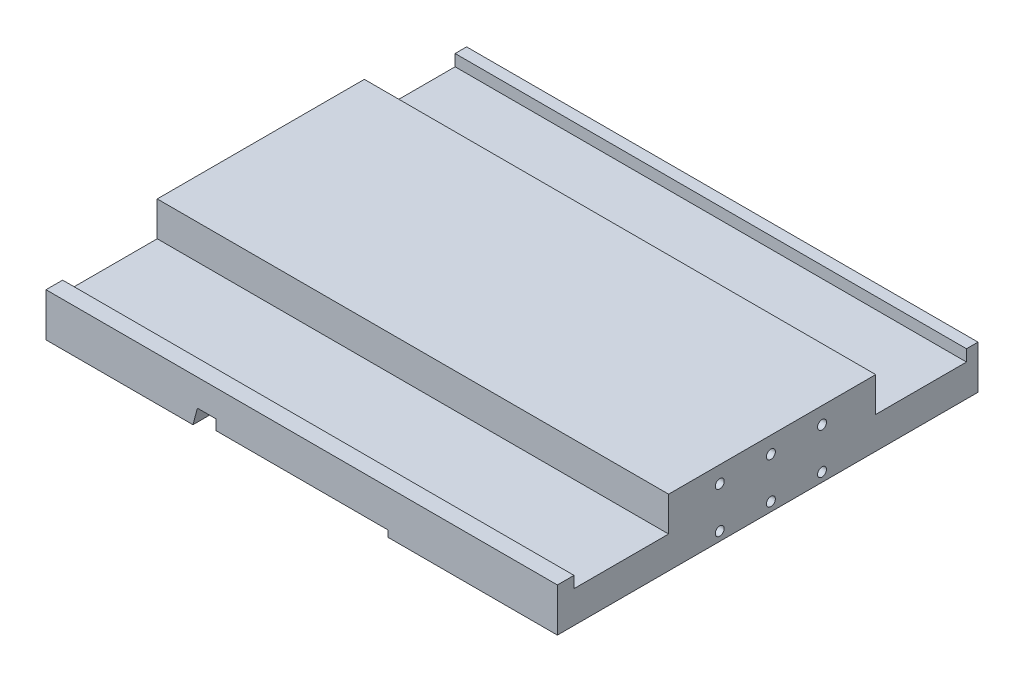
ISO-10303-21;
HEADER;
FILE_DESCRIPTION(('STEP AP214'),'2;1');
FILE_NAME('part.step','',(''),(''),'','','');
FILE_SCHEMA(('AUTOMOTIVE_DESIGN { 1 0 10303 214 1 1 1 1 }'));
ENDSEC;
DATA;
#1=APPLICATION_CONTEXT('core data for automotive mechanical design processes');
#2=APPLICATION_PROTOCOL_DEFINITION('international standard','automotive_design',2000,#1);
#3=PRODUCT_CONTEXT('',#1,'mechanical');
#4=PRODUCT('Part','Part','',(#3));
#5=PRODUCT_RELATED_PRODUCT_CATEGORY('part','',(#4));
#6=PRODUCT_DEFINITION_FORMATION('','',#4);
#7=PRODUCT_DEFINITION_CONTEXT('part definition',#1,'design');
#8=PRODUCT_DEFINITION('design','',#6,#7);
#9=PRODUCT_DEFINITION_SHAPE('','',#8);
#10=(LENGTH_UNIT() NAMED_UNIT(*) SI_UNIT(.MILLI.,.METRE.));
#11=(NAMED_UNIT(*) PLANE_ANGLE_UNIT() SI_UNIT($,.RADIAN.));
#12=(NAMED_UNIT(*) SI_UNIT($,.STERADIAN.) SOLID_ANGLE_UNIT());
#13=UNCERTAINTY_MEASURE_WITH_UNIT(LENGTH_MEASURE(1.E-05),#10,'distance_accuracy_value','');
#14=(GEOMETRIC_REPRESENTATION_CONTEXT(3) GLOBAL_UNCERTAINTY_ASSIGNED_CONTEXT((#13)) GLOBAL_UNIT_ASSIGNED_CONTEXT((#10,
#11,#12)) REPRESENTATION_CONTEXT('',''));
#15=CARTESIAN_POINT('',(0.,0.,0.));
#16=DIRECTION('',(0.,0.,1.));
#17=DIRECTION('',(1.,0.,0.));
#18=AXIS2_PLACEMENT_3D('',#15,#16,#17);
#19=CARTESIAN_POINT('',(0.,25.,0.));
#20=DIRECTION('',(0.,0.,-1.));
#21=DIRECTION('',(-1.,0.,0.));
#22=AXIS2_PLACEMENT_3D('',#19,#20,#21);
#23=PLANE('',#22);
#24=DIRECTION('',(-0.258819045102519,-0.965925826289069,0.));
#25=VECTOR('',#24,1.);
#26=CARTESIAN_POINT('',(113.50737148729,-5.41420852499843,0.));
#27=LINE('',#26,#25);
#28=CARTESIAN_POINT('',(118.440604052634,12.9968660544185,0.));
#29=VERTEX_POINT('',#28);
#30=CARTESIAN_POINT('',(114.958104289217,0.,0.));
#31=VERTEX_POINT('',#30);
#32=EDGE_CURVE('E227',#29,#31,#27,.T.);
#33=ORIENTED_EDGE('',*,*,#32,.F.);
#34=DIRECTION('',(-1.,0.,0.));
#35=VECTOR('',#34,1.);
#36=CARTESIAN_POINT('',(0.,12.9968660544185,0.));
#37=LINE('',#36,#35);
#38=CARTESIAN_POINT('',(133.,12.9968660544185,0.));
#39=VERTEX_POINT('',#38);
#40=EDGE_CURVE('E184',#39,#29,#37,.T.);
#41=ORIENTED_EDGE('',*,*,#40,.F.);
#42=DIRECTION('',(0.,1.,0.));
#43=VECTOR('',#42,1.);
#44=CARTESIAN_POINT('',(133.,25.,0.));
#45=LINE('',#44,#43);
#46=CARTESIAN_POINT('',(133.,5.,0.));
#47=VERTEX_POINT('',#46);
#48=EDGE_CURVE('E68',#47,#39,#45,.T.);
#49=ORIENTED_EDGE('',*,*,#48,.F.);
#50=DIRECTION('',(-1.,0.,0.));
#51=VECTOR('',#50,1.);
#52=CARTESIAN_POINT('',(0.,5.,0.));
#53=LINE('',#52,#51);
#54=CARTESIAN_POINT('',(267.5,5.,0.));
#55=VERTEX_POINT('',#54);
#56=EDGE_CURVE('E232',#55,#47,#53,.T.);
#57=ORIENTED_EDGE('',*,*,#56,.F.);
#58=DIRECTION('',(0.,1.,0.));
#59=VECTOR('',#58,1.);
#60=CARTESIAN_POINT('',(267.5,25.,0.));
#61=LINE('',#60,#59);
#62=CARTESIAN_POINT('',(267.5,0.,0.));
#63=VERTEX_POINT('',#62);
#64=EDGE_CURVE('E222',#63,#55,#61,.T.);
#65=ORIENTED_EDGE('',*,*,#64,.F.);
#66=DIRECTION('',(1.,0.,0.));
#67=VECTOR('',#66,1.);
#68=CARTESIAN_POINT('',(0.,0.,0.));
#69=LINE('',#68,#67);
#70=CARTESIAN_POINT('',(400.,0.,0.));
#71=VERTEX_POINT('',#70);
#72=EDGE_CURVE('E337',#63,#71,#69,.T.);
#73=ORIENTED_EDGE('',*,*,#72,.T.);
#74=DIRECTION('',(0.,-1.,0.));
#75=VECTOR('',#74,1.);
#76=CARTESIAN_POINT('',(400.,25.,0.));
#77=LINE('',#76,#75);
#78=CARTESIAN_POINT('',(400.,34.,0.));
#79=VERTEX_POINT('',#78);
#80=EDGE_CURVE('E357',#79,#71,#77,.T.);
#81=ORIENTED_EDGE('',*,*,#80,.F.);
#82=DIRECTION('',(1.,0.,0.));
#83=VECTOR('',#82,1.);
#84=CARTESIAN_POINT('',(400.,34.,0.));
#85=LINE('',#84,#83);
#86=CARTESIAN_POINT('',(0.,34.,0.));
#87=VERTEX_POINT('',#86);
#88=EDGE_CURVE('E249',#87,#79,#85,.T.);
#89=ORIENTED_EDGE('',*,*,#88,.F.);
#90=DIRECTION('',(0.,-1.,0.));
#91=VECTOR('',#90,1.);
#92=CARTESIAN_POINT('',(0.,25.,0.));
#93=LINE('',#92,#91);
#94=CARTESIAN_POINT('',(0.,0.,0.));
#95=VERTEX_POINT('',#94);
#96=EDGE_CURVE('E361',#87,#95,#93,.T.);
#97=ORIENTED_EDGE('',*,*,#96,.T.);
#98=EDGE_CURVE('E338',#95,#31,#69,.T.);
#99=ORIENTED_EDGE('',*,*,#98,.T.);
#100=EDGE_LOOP('',(#33,#41,#49,#57,#65,#73,#81,#89,#97,#99));
#101=FACE_BOUND('',#100,.T.);
#102=ADVANCED_FACE('F47',(#101),#23,.F.);
#103=CARTESIAN_POINT('',(0.,25.,-329.));
#104=DIRECTION('',(0.,0.,1.));
#105=DIRECTION('',(1.,0.,0.));
#106=AXIS2_PLACEMENT_3D('',#103,#104,#105);
#107=PLANE('',#106);
#108=DIRECTION('',(1.,0.,0.));
#109=VECTOR('',#108,1.);
#110=CARTESIAN_POINT('',(0.,12.9968660544185,-329.));
#111=LINE('',#110,#109);
#112=CARTESIAN_POINT('',(118.440604052634,12.9968660544185,-329.));
#113=VERTEX_POINT('',#112);
#114=CARTESIAN_POINT('',(133.,12.9968660544185,-329.));
#115=VERTEX_POINT('',#114);
#116=EDGE_CURVE('E173',#113,#115,#111,.T.);
#117=ORIENTED_EDGE('',*,*,#116,.F.);
#118=DIRECTION('',(-0.258819045102518,-0.965925826289069,0.));
#119=VECTOR('',#118,1.);
#120=CARTESIAN_POINT('',(107.25737148729,-28.7395260723039,-329.));
#121=LINE('',#120,#119);
#122=CARTESIAN_POINT('',(114.958104289217,0.,-329.));
#123=VERTEX_POINT('',#122);
#124=EDGE_CURVE('E177',#113,#123,#121,.T.);
#125=ORIENTED_EDGE('',*,*,#124,.T.);
#126=DIRECTION('',(-1.,0.,0.));
#127=VECTOR('',#126,1.);
#128=CARTESIAN_POINT('',(0.,0.,-329.));
#129=LINE('',#128,#127);
#130=CARTESIAN_POINT('',(0.,0.,-329.));
#131=VERTEX_POINT('',#130);
#132=EDGE_CURVE('E345',#123,#131,#129,.T.);
#133=ORIENTED_EDGE('',*,*,#132,.T.);
#134=DIRECTION('',(0.,-1.,0.));
#135=VECTOR('',#134,1.);
#136=CARTESIAN_POINT('',(0.,25.,-329.));
#137=LINE('',#136,#135);
#138=CARTESIAN_POINT('',(0.,34.,-329.));
#139=VERTEX_POINT('',#138);
#140=EDGE_CURVE('E333',#139,#131,#137,.T.);
#141=ORIENTED_EDGE('',*,*,#140,.F.);
#142=DIRECTION('',(-1.,0.,0.));
#143=VECTOR('',#142,1.);
#144=CARTESIAN_POINT('',(400.,34.,-329.));
#145=LINE('',#144,#143);
#146=CARTESIAN_POINT('',(400.,34.,-329.));
#147=VERTEX_POINT('',#146);
#148=EDGE_CURVE('E262',#147,#139,#145,.T.);
#149=ORIENTED_EDGE('',*,*,#148,.F.);
#150=DIRECTION('',(0.,-1.,0.));
#151=VECTOR('',#150,1.);
#152=CARTESIAN_POINT('',(400.,25.,-329.));
#153=LINE('',#152,#151);
#154=CARTESIAN_POINT('',(400.,0.,-329.));
#155=VERTEX_POINT('',#154);
#156=EDGE_CURVE('E353',#147,#155,#153,.T.);
#157=ORIENTED_EDGE('',*,*,#156,.T.);
#158=CARTESIAN_POINT('',(267.5,0.,-329.));
#159=VERTEX_POINT('',#158);
#160=EDGE_CURVE('E346',#155,#159,#129,.T.);
#161=ORIENTED_EDGE('',*,*,#160,.T.);
#162=DIRECTION('',(0.,1.,0.));
#163=VECTOR('',#162,1.);
#164=CARTESIAN_POINT('',(267.5,0.,-329.));
#165=LINE('',#164,#163);
#166=CARTESIAN_POINT('',(267.5,5.,-329.));
#167=VERTEX_POINT('',#166);
#168=EDGE_CURVE('E214',#159,#167,#165,.T.);
#169=ORIENTED_EDGE('',*,*,#168,.T.);
#170=DIRECTION('',(-1.,0.,0.));
#171=VECTOR('',#170,1.);
#172=CARTESIAN_POINT('',(0.,5.,-329.));
#173=LINE('',#172,#171);
#174=CARTESIAN_POINT('',(133.,5.,-329.));
#175=VERTEX_POINT('',#174);
#176=EDGE_CURVE('E203',#167,#175,#173,.T.);
#177=ORIENTED_EDGE('',*,*,#176,.T.);
#178=DIRECTION('',(0.,1.,0.));
#179=VECTOR('',#178,1.);
#180=CARTESIAN_POINT('',(133.,0.,-329.));
#181=LINE('',#180,#179);
#182=EDGE_CURVE('E180',#175,#115,#181,.T.);
#183=ORIENTED_EDGE('',*,*,#182,.T.);
#184=EDGE_LOOP('',(#117,#125,#133,#141,#149,#157,#161,#169,#177,#183));
#185=FACE_BOUND('',#184,.T.);
#186=ADVANCED_FACE('F175',(#185),#107,.F.);
#187=CARTESIAN_POINT('',(0.,0.,0.));
#188=DIRECTION('',(0.,-1.,0.));
#189=DIRECTION('',(0.,0.,-1.));
#190=AXIS2_PLACEMENT_3D('',#187,#188,#189);
#191=PLANE('',#190);
#192=ORIENTED_EDGE('',*,*,#132,.F.);
#193=DIRECTION('',(0.,0.,1.));
#194=VECTOR('',#193,1.);
#195=CARTESIAN_POINT('',(114.958104289217,0.,0.));
#196=LINE('',#195,#194);
#197=EDGE_CURVE('E11',#123,#31,#196,.T.);
#198=ORIENTED_EDGE('',*,*,#197,.T.);
#199=ORIENTED_EDGE('',*,*,#98,.F.);
#200=DIRECTION('',(0.,0.,1.));
#201=VECTOR('',#200,1.);
#202=CARTESIAN_POINT('',(0.,0.,0.));
#203=LINE('',#202,#201);
#204=EDGE_CURVE('E324',#131,#95,#203,.T.);
#205=ORIENTED_EDGE('',*,*,#204,.F.);
#206=EDGE_LOOP('',(#192,#198,#199,#205));
#207=FACE_BOUND('',#206,.T.);
#208=ADVANCED_FACE('F421',(#207),#191,.T.);
#209=ORIENTED_EDGE('',*,*,#72,.F.);
#210=DIRECTION('',(0.,0.,-1.));
#211=VECTOR('',#210,1.);
#212=CARTESIAN_POINT('',(267.5,0.,0.));
#213=LINE('',#212,#211);
#214=EDGE_CURVE('E56',#63,#159,#213,.T.);
#215=ORIENTED_EDGE('',*,*,#214,.T.);
#216=ORIENTED_EDGE('',*,*,#160,.F.);
#217=DIRECTION('',(0.,0.,-1.));
#218=VECTOR('',#217,1.);
#219=CARTESIAN_POINT('',(400.,0.,0.));
#220=LINE('',#219,#218);
#221=EDGE_CURVE('E342',#71,#155,#220,.T.);
#222=ORIENTED_EDGE('',*,*,#221,.F.);
#223=EDGE_LOOP('',(#209,#215,#216,#222));
#224=FACE_BOUND('',#223,.T.);
#225=ADVANCED_FACE('F369',(#224),#191,.T.);
#226=CARTESIAN_POINT('',(0.,25.,0.));
#227=DIRECTION('',(0.,-1.,0.));
#228=DIRECTION('',(0.,0.,-1.));
#229=AXIS2_PLACEMENT_3D('',#226,#227,#228);
#230=PLANE('',#229);
#231=DIRECTION('',(-1.,0.,0.));
#232=VECTOR('',#231,1.);
#233=CARTESIAN_POINT('',(0.,25.,-13.));
#234=LINE('',#233,#232);
#235=CARTESIAN_POINT('',(400.,25.,-13.));
#236=VERTEX_POINT('',#235);
#237=CARTESIAN_POINT('',(0.,25.,-13.));
#238=VERTEX_POINT('',#237);
#239=EDGE_CURVE('E244',#236,#238,#234,.T.);
#240=ORIENTED_EDGE('',*,*,#239,.F.);
#241=DIRECTION('',(0.,0.,-1.));
#242=VECTOR('',#241,1.);
#243=CARTESIAN_POINT('',(400.,25.,0.));
#244=LINE('',#243,#242);
#245=CARTESIAN_POINT('',(400.,25.,-87.));
#246=VERTEX_POINT('',#245);
#247=EDGE_CURVE('E330',#236,#246,#244,.T.);
#248=ORIENTED_EDGE('',*,*,#247,.T.);
#249=DIRECTION('',(1.,0.,0.));
#250=VECTOR('',#249,1.);
#251=CARTESIAN_POINT('',(400.,25.,-87.));
#252=LINE('',#251,#250);
#253=CARTESIAN_POINT('',(0.,25.,-87.));
#254=VERTEX_POINT('',#253);
#255=EDGE_CURVE('E287',#254,#246,#252,.T.);
#256=ORIENTED_EDGE('',*,*,#255,.F.);
#257=DIRECTION('',(0.,0.,1.));
#258=VECTOR('',#257,1.);
#259=CARTESIAN_POINT('',(0.,25.,0.));
#260=LINE('',#259,#258);
#261=EDGE_CURVE('E329',#254,#238,#260,.T.);
#262=ORIENTED_EDGE('',*,*,#261,.T.);
#263=EDGE_LOOP('',(#240,#248,#256,#262));
#264=FACE_BOUND('',#263,.T.);
#265=ADVANCED_FACE('F405',(#264),#230,.F.);
#266=DIRECTION('',(1.,0.,0.));
#267=VECTOR('',#266,1.);
#268=CARTESIAN_POINT('',(0.,25.,-320.));
#269=LINE('',#268,#267);
#270=CARTESIAN_POINT('',(0.,25.,-320.));
#271=VERTEX_POINT('',#270);
#272=CARTESIAN_POINT('',(400.,25.,-320.));
#273=VERTEX_POINT('',#272);
#274=EDGE_CURVE('E248',#271,#273,#269,.T.);
#275=ORIENTED_EDGE('',*,*,#274,.F.);
#276=CARTESIAN_POINT('',(0.,25.,-249.));
#277=VERTEX_POINT('',#276);
#278=EDGE_CURVE('E325',#271,#277,#260,.T.);
#279=ORIENTED_EDGE('',*,*,#278,.T.);
#280=DIRECTION('',(-1.,0.,0.));
#281=VECTOR('',#280,1.);
#282=CARTESIAN_POINT('',(0.,25.,-249.));
#283=LINE('',#282,#281);
#284=CARTESIAN_POINT('',(400.,25.,-249.));
#285=VERTEX_POINT('',#284);
#286=EDGE_CURVE('E293',#285,#277,#283,.T.);
#287=ORIENTED_EDGE('',*,*,#286,.F.);
#288=EDGE_CURVE('E328',#285,#273,#244,.T.);
#289=ORIENTED_EDGE('',*,*,#288,.T.);
#290=EDGE_LOOP('',(#275,#279,#287,#289));
#291=FACE_BOUND('',#290,.T.);
#292=ADVANCED_FACE('F423',(#291),#230,.F.);
#293=CARTESIAN_POINT('',(0.,25.,0.));
#294=DIRECTION('',(1.,0.,0.));
#295=DIRECTION('',(0.,0.,-1.));
#296=AXIS2_PLACEMENT_3D('',#293,#294,#295);
#297=PLANE('',#296);
#298=ORIENTED_EDGE('',*,*,#204,.T.);
#299=ORIENTED_EDGE('',*,*,#96,.F.);
#300=DIRECTION('',(0.,0.,1.));
#301=VECTOR('',#300,1.);
#302=CARTESIAN_POINT('',(0.,34.,0.));
#303=LINE('',#302,#301);
#304=CARTESIAN_POINT('',(0.,34.,-13.));
#305=VERTEX_POINT('',#304);
#306=EDGE_CURVE('E243',#305,#87,#303,.T.);
#307=ORIENTED_EDGE('',*,*,#306,.F.);
#308=DIRECTION('',(0.,-1.,0.));
#309=VECTOR('',#308,1.);
#310=CARTESIAN_POINT('',(0.,34.,-13.));
#311=LINE('',#310,#309);
#312=EDGE_CURVE('E239',#305,#238,#311,.T.);
#313=ORIENTED_EDGE('',*,*,#312,.T.);
#314=ORIENTED_EDGE('',*,*,#261,.F.);
#315=DIRECTION('',(0.,-1.,0.));
#316=VECTOR('',#315,1.);
#317=CARTESIAN_POINT('',(0.,52.,-87.));
#318=LINE('',#317,#316);
#319=CARTESIAN_POINT('',(0.,52.,-87.));
#320=VERTEX_POINT('',#319);
#321=EDGE_CURVE('E320',#320,#254,#318,.T.);
#322=ORIENTED_EDGE('',*,*,#321,.F.);
#323=DIRECTION('',(0.,0.,1.));
#324=VECTOR('',#323,1.);
#325=CARTESIAN_POINT('',(0.,52.,-87.));
#326=LINE('',#325,#324);
#327=CARTESIAN_POINT('',(0.,52.,-249.));
#328=VERTEX_POINT('',#327);
#329=EDGE_CURVE('E288',#328,#320,#326,.T.);
#330=ORIENTED_EDGE('',*,*,#329,.F.);
#331=DIRECTION('',(0.,-1.,0.));
#332=VECTOR('',#331,1.);
#333=CARTESIAN_POINT('',(0.,52.,-249.));
#334=LINE('',#333,#332);
#335=EDGE_CURVE('E302',#328,#277,#334,.T.);
#336=ORIENTED_EDGE('',*,*,#335,.T.);
#337=ORIENTED_EDGE('',*,*,#278,.F.);
#338=DIRECTION('',(0.,-1.,0.));
#339=VECTOR('',#338,1.);
#340=CARTESIAN_POINT('',(0.,34.,-320.));
#341=LINE('',#340,#339);
#342=CARTESIAN_POINT('',(0.,34.,-320.));
#343=VERTEX_POINT('',#342);
#344=EDGE_CURVE('E283',#343,#271,#341,.T.);
#345=ORIENTED_EDGE('',*,*,#344,.F.);
#346=DIRECTION('',(0.,0.,1.));
#347=VECTOR('',#346,1.);
#348=CARTESIAN_POINT('',(0.,34.,-329.));
#349=LINE('',#348,#347);
#350=EDGE_CURVE('E266',#139,#343,#349,.T.);
#351=ORIENTED_EDGE('',*,*,#350,.F.);
#352=ORIENTED_EDGE('',*,*,#140,.T.);
#353=EDGE_LOOP('',(#298,#299,#307,#313,#314,#322,#330,#336,#337,#345,#351,#352));
#354=FACE_BOUND('',#353,.T.);
#355=ADVANCED_FACE('F49',(#354),#297,.F.);
#356=CARTESIAN_POINT('',(400.,25.,0.));
#357=DIRECTION('',(-1.,0.,0.));
#358=DIRECTION('',(0.,0.,1.));
#359=AXIS2_PLACEMENT_3D('',#356,#357,#358);
#360=PLANE('',#359);
#361=CARTESIAN_POINT('',(400.,39.0267931089589,-127.));
#362=DIRECTION('',(1.,0.,0.));
#363=DIRECTION('',(0.,0.,-1.));
#364=AXIS2_PLACEMENT_3D('',#361,#362,#363);
#365=CIRCLE('',#364,3.49999999999999);
#366=CARTESIAN_POINT('',(400.,39.0267931089589,-130.5));
#367=VERTEX_POINT('',#366);
#368=EDGE_CURVE('E994',#367,#367,#365,.T.);
#369=ORIENTED_EDGE('',*,*,#368,.F.);
#370=EDGE_LOOP('',(#369));
#371=FACE_BOUND('',#370,.T.);
#372=CARTESIAN_POINT('',(400.,7.02679310895895,-167.));
#373=DIRECTION('',(1.,0.,0.));
#374=DIRECTION('',(0.,0.,-1.));
#375=AXIS2_PLACEMENT_3D('',#372,#373,#374);
#376=CIRCLE('',#375,3.49999999999999);
#377=CARTESIAN_POINT('',(400.,7.02679310895895,-170.5));
#378=VERTEX_POINT('',#377);
#379=EDGE_CURVE('E1024',#378,#378,#376,.T.);
#380=ORIENTED_EDGE('',*,*,#379,.F.);
#381=EDGE_LOOP('',(#380));
#382=FACE_BOUND('',#381,.T.);
#383=CARTESIAN_POINT('',(400.,39.0267931089589,-167.));
#384=DIRECTION('',(1.,0.,0.));
#385=DIRECTION('',(0.,0.,-1.));
#386=AXIS2_PLACEMENT_3D('',#383,#384,#385);
#387=CIRCLE('',#386,3.49999999999999);
#388=CARTESIAN_POINT('',(400.,39.0267931089589,-170.5));
#389=VERTEX_POINT('',#388);
#390=EDGE_CURVE('E1016',#389,#389,#387,.T.);
#391=ORIENTED_EDGE('',*,*,#390,.F.);
#392=EDGE_LOOP('',(#391));
#393=FACE_BOUND('',#392,.T.);
#394=CARTESIAN_POINT('',(400.,7.02679310895895,-207.));
#395=DIRECTION('',(1.,0.,0.));
#396=DIRECTION('',(0.,0.,-1.));
#397=AXIS2_PLACEMENT_3D('',#394,#395,#396);
#398=CIRCLE('',#397,3.49999999999999);
#399=CARTESIAN_POINT('',(400.,7.02679310895895,-210.5));
#400=VERTEX_POINT('',#399);
#401=EDGE_CURVE('E1007',#400,#400,#398,.T.);
#402=ORIENTED_EDGE('',*,*,#401,.F.);
#403=EDGE_LOOP('',(#402));
#404=FACE_BOUND('',#403,.T.);
#405=CARTESIAN_POINT('',(400.,7.02679310895894,-127.));
#406=DIRECTION('',(1.,0.,0.));
#407=DIRECTION('',(0.,0.,-1.));
#408=AXIS2_PLACEMENT_3D('',#405,#406,#407);
#409=CIRCLE('',#408,3.49999999999999);
#410=CARTESIAN_POINT('',(400.,7.02679310895894,-130.5));
#411=VERTEX_POINT('',#410);
#412=EDGE_CURVE('E995',#411,#411,#409,.T.);
#413=ORIENTED_EDGE('',*,*,#412,.F.);
#414=EDGE_LOOP('',(#413));
#415=FACE_BOUND('',#414,.T.);
#416=CARTESIAN_POINT('',(400.,39.026793108959,-207.));
#417=DIRECTION('',(1.,0.,0.));
#418=DIRECTION('',(0.,0.,-1.));
#419=AXIS2_PLACEMENT_3D('',#416,#417,#418);
#420=CIRCLE('',#419,3.49999999999999);
#421=CARTESIAN_POINT('',(400.,39.026793108959,-210.5));
#422=VERTEX_POINT('',#421);
#423=EDGE_CURVE('E1011',#422,#422,#420,.T.);
#424=ORIENTED_EDGE('',*,*,#423,.F.);
#425=EDGE_LOOP('',(#424));
#426=FACE_BOUND('',#425,.T.);
#427=ORIENTED_EDGE('',*,*,#221,.T.);
#428=ORIENTED_EDGE('',*,*,#156,.F.);
#429=DIRECTION('',(0.,0.,-1.));
#430=VECTOR('',#429,1.);
#431=CARTESIAN_POINT('',(400.,34.,-320.));
#432=LINE('',#431,#430);
#433=CARTESIAN_POINT('',(400.,34.,-320.));
#434=VERTEX_POINT('',#433);
#435=EDGE_CURVE('E272',#434,#147,#432,.T.);
#436=ORIENTED_EDGE('',*,*,#435,.F.);
#437=DIRECTION('',(0.,-1.,0.));
#438=VECTOR('',#437,1.);
#439=CARTESIAN_POINT('',(400.,34.,-320.));
#440=LINE('',#439,#438);
#441=EDGE_CURVE('E276',#434,#273,#440,.T.);
#442=ORIENTED_EDGE('',*,*,#441,.T.);
#443=ORIENTED_EDGE('',*,*,#288,.F.);
#444=DIRECTION('',(0.,-1.,0.));
#445=VECTOR('',#444,1.);
#446=CARTESIAN_POINT('',(400.,52.,-249.));
#447=LINE('',#446,#445);
#448=CARTESIAN_POINT('',(400.,52.,-249.));
#449=VERTEX_POINT('',#448);
#450=EDGE_CURVE('E312',#449,#285,#447,.T.);
#451=ORIENTED_EDGE('',*,*,#450,.F.);
#452=DIRECTION('',(0.,0.,-1.));
#453=VECTOR('',#452,1.);
#454=CARTESIAN_POINT('',(400.,52.,-249.));
#455=LINE('',#454,#453);
#456=CARTESIAN_POINT('',(400.,52.,-87.));
#457=VERTEX_POINT('',#456);
#458=EDGE_CURVE('E296',#457,#449,#455,.T.);
#459=ORIENTED_EDGE('',*,*,#458,.F.);
#460=DIRECTION('',(0.,-1.,0.));
#461=VECTOR('',#460,1.);
#462=CARTESIAN_POINT('',(400.,52.,-87.));
#463=LINE('',#462,#461);
#464=EDGE_CURVE('E316',#457,#246,#463,.T.);
#465=ORIENTED_EDGE('',*,*,#464,.T.);
#466=ORIENTED_EDGE('',*,*,#247,.F.);
#467=DIRECTION('',(0.,-1.,0.));
#468=VECTOR('',#467,1.);
#469=CARTESIAN_POINT('',(400.,34.,-13.));
#470=LINE('',#469,#468);
#471=CARTESIAN_POINT('',(400.,34.,-13.));
#472=VERTEX_POINT('',#471);
#473=EDGE_CURVE('E235',#472,#236,#470,.T.);
#474=ORIENTED_EDGE('',*,*,#473,.F.);
#475=DIRECTION('',(0.,0.,-1.));
#476=VECTOR('',#475,1.);
#477=CARTESIAN_POINT('',(400.,34.,-13.));
#478=LINE('',#477,#476);
#479=EDGE_CURVE('E256',#79,#472,#478,.T.);
#480=ORIENTED_EDGE('',*,*,#479,.F.);
#481=ORIENTED_EDGE('',*,*,#80,.T.);
#482=EDGE_LOOP('',(#427,#428,#436,#442,#443,#451,#459,#465,#466,#474,#480,#481));
#483=FACE_BOUND('',#482,.T.);
#484=ADVANCED_FACE('F376',(#371,#382,#393,#404,#415,#426,#483),#360,.F.);
#485=CARTESIAN_POINT('',(400.,52.,-87.));
#486=DIRECTION('',(0.,0.,-1.));
#487=DIRECTION('',(-1.,0.,0.));
#488=AXIS2_PLACEMENT_3D('',#485,#486,#487);
#489=PLANE('',#488);
#490=ORIENTED_EDGE('',*,*,#255,.T.);
#491=ORIENTED_EDGE('',*,*,#464,.F.);
#492=DIRECTION('',(1.,0.,0.));
#493=VECTOR('',#492,1.);
#494=CARTESIAN_POINT('',(400.,52.,-87.));
#495=LINE('',#494,#493);
#496=EDGE_CURVE('E292',#320,#457,#495,.T.);
#497=ORIENTED_EDGE('',*,*,#496,.F.);
#498=ORIENTED_EDGE('',*,*,#321,.T.);
#499=EDGE_LOOP('',(#490,#491,#497,#498));
#500=FACE_BOUND('',#499,.T.);
#501=ADVANCED_FACE('F402',(#500),#489,.F.);
#502=CARTESIAN_POINT('',(0.,52.,-249.));
#503=DIRECTION('',(0.,0.,1.));
#504=DIRECTION('',(1.,0.,0.));
#505=AXIS2_PLACEMENT_3D('',#502,#503,#504);
#506=PLANE('',#505);
#507=ORIENTED_EDGE('',*,*,#286,.T.);
#508=ORIENTED_EDGE('',*,*,#335,.F.);
#509=DIRECTION('',(-1.,0.,0.));
#510=VECTOR('',#509,1.);
#511=CARTESIAN_POINT('',(0.,52.,-249.));
#512=LINE('',#511,#510);
#513=EDGE_CURVE('E299',#449,#328,#512,.T.);
#514=ORIENTED_EDGE('',*,*,#513,.F.);
#515=ORIENTED_EDGE('',*,*,#450,.T.);
#516=EDGE_LOOP('',(#507,#508,#514,#515));
#517=FACE_BOUND('',#516,.T.);
#518=ADVANCED_FACE('F392',(#517),#506,.F.);
#519=CARTESIAN_POINT('',(0.,52.,0.));
#520=DIRECTION('',(0.,-1.,0.));
#521=DIRECTION('',(0.,0.,-1.));
#522=AXIS2_PLACEMENT_3D('',#519,#520,#521);
#523=PLANE('',#522);
#524=ORIENTED_EDGE('',*,*,#329,.T.);
#525=ORIENTED_EDGE('',*,*,#496,.T.);
#526=ORIENTED_EDGE('',*,*,#458,.T.);
#527=ORIENTED_EDGE('',*,*,#513,.T.);
#528=EDGE_LOOP('',(#524,#525,#526,#527));
#529=FACE_BOUND('',#528,.T.);
#530=ADVANCED_FACE('F396',(#529),#523,.F.);
#531=CARTESIAN_POINT('',(0.,34.,-320.));
#532=DIRECTION('',(0.,0.,-1.));
#533=DIRECTION('',(-1.,0.,0.));
#534=AXIS2_PLACEMENT_3D('',#531,#532,#533);
#535=PLANE('',#534);
#536=ORIENTED_EDGE('',*,*,#274,.T.);
#537=ORIENTED_EDGE('',*,*,#441,.F.);
#538=DIRECTION('',(1.,0.,0.));
#539=VECTOR('',#538,1.);
#540=CARTESIAN_POINT('',(0.,34.,-320.));
#541=LINE('',#540,#539);
#542=EDGE_CURVE('E269',#343,#434,#541,.T.);
#543=ORIENTED_EDGE('',*,*,#542,.F.);
#544=ORIENTED_EDGE('',*,*,#344,.T.);
#545=EDGE_LOOP('',(#536,#537,#543,#544));
#546=FACE_BOUND('',#545,.T.);
#547=ADVANCED_FACE('F384',(#546),#535,.F.);
#548=CARTESIAN_POINT('',(0.,34.,0.));
#549=DIRECTION('',(0.,1.,0.));
#550=DIRECTION('',(0.,0.,1.));
#551=AXIS2_PLACEMENT_3D('',#548,#549,#550);
#552=PLANE('',#551);
#553=ORIENTED_EDGE('',*,*,#148,.T.);
#554=ORIENTED_EDGE('',*,*,#350,.T.);
#555=ORIENTED_EDGE('',*,*,#542,.T.);
#556=ORIENTED_EDGE('',*,*,#435,.T.);
#557=EDGE_LOOP('',(#553,#554,#555,#556));
#558=FACE_BOUND('',#557,.T.);
#559=ADVANCED_FACE('F378',(#558),#552,.T.);
#560=CARTESIAN_POINT('',(0.,34.,-13.));
#561=DIRECTION('',(0.,0.,1.));
#562=DIRECTION('',(1.,0.,0.));
#563=AXIS2_PLACEMENT_3D('',#560,#561,#562);
#564=PLANE('',#563);
#565=ORIENTED_EDGE('',*,*,#239,.T.);
#566=ORIENTED_EDGE('',*,*,#312,.F.);
#567=DIRECTION('',(-1.,0.,0.));
#568=VECTOR('',#567,1.);
#569=CARTESIAN_POINT('',(0.,34.,-13.));
#570=LINE('',#569,#568);
#571=EDGE_CURVE('E253',#472,#305,#570,.T.);
#572=ORIENTED_EDGE('',*,*,#571,.F.);
#573=ORIENTED_EDGE('',*,*,#473,.T.);
#574=EDGE_LOOP('',(#565,#566,#572,#573));
#575=FACE_BOUND('',#574,.T.);
#576=ADVANCED_FACE('F800',(#575),#564,.F.);
#577=CARTESIAN_POINT('',(0.,34.,0.));
#578=DIRECTION('',(0.,-1.,0.));
#579=DIRECTION('',(0.,0.,-1.));
#580=AXIS2_PLACEMENT_3D('',#577,#578,#579);
#581=PLANE('',#580);
#582=ORIENTED_EDGE('',*,*,#88,.T.);
#583=ORIENTED_EDGE('',*,*,#479,.T.);
#584=ORIENTED_EDGE('',*,*,#571,.T.);
#585=ORIENTED_EDGE('',*,*,#306,.T.);
#586=EDGE_LOOP('',(#582,#583,#584,#585));
#587=FACE_BOUND('',#586,.T.);
#588=ADVANCED_FACE('F418',(#587),#581,.F.);
#589=CARTESIAN_POINT('',(0.,5.,71.));
#590=DIRECTION('',(0.,-1.,0.));
#591=DIRECTION('',(0.,0.,-1.));
#592=AXIS2_PLACEMENT_3D('',#589,#590,#591);
#593=PLANE('',#592);
#594=ORIENTED_EDGE('',*,*,#56,.T.);
#595=DIRECTION('',(0.,0.,-1.));
#596=VECTOR('',#595,1.);
#597=CARTESIAN_POINT('',(133.,5.,71.));
#598=LINE('',#597,#596);
#599=EDGE_CURVE('E218',#47,#175,#598,.T.);
#600=ORIENTED_EDGE('',*,*,#599,.T.);
#601=ORIENTED_EDGE('',*,*,#176,.F.);
#602=DIRECTION('',(0.,0.,-1.));
#603=VECTOR('',#602,1.);
#604=CARTESIAN_POINT('',(267.5,5.,71.));
#605=LINE('',#604,#603);
#606=EDGE_CURVE('E219',#55,#167,#605,.T.);
#607=ORIENTED_EDGE('',*,*,#606,.F.);
#608=EDGE_LOOP('',(#594,#600,#601,#607));
#609=FACE_BOUND('',#608,.T.);
#610=ADVANCED_FACE('F452',(#609),#593,.T.);
#611=CARTESIAN_POINT('',(133.,0.,71.));
#612=DIRECTION('',(-1.,0.,0.));
#613=DIRECTION('',(0.,0.,1.));
#614=AXIS2_PLACEMENT_3D('',#611,#612,#613);
#615=PLANE('',#614);
#616=DIRECTION('',(0.,0.,1.));
#617=VECTOR('',#616,1.);
#618=CARTESIAN_POINT('',(133.,12.9968660544185,0.));
#619=LINE('',#618,#617);
#620=EDGE_CURVE('E63',#115,#39,#619,.T.);
#621=ORIENTED_EDGE('',*,*,#620,.F.);
#622=ORIENTED_EDGE('',*,*,#182,.F.);
#623=ORIENTED_EDGE('',*,*,#599,.F.);
#624=ORIENTED_EDGE('',*,*,#48,.T.);
#625=EDGE_LOOP('',(#621,#622,#623,#624));
#626=FACE_BOUND('',#625,.T.);
#627=ADVANCED_FACE('F456',(#626),#615,.T.);
#628=CARTESIAN_POINT('',(107.25737148729,-28.7395260723039,71.));
#629=DIRECTION('',(0.965925826289069,-0.258819045102518,0.));
#630=DIRECTION('',(0.258819045102519,0.965925826289069,0.));
#631=AXIS2_PLACEMENT_3D('',#628,#629,#630);
#632=PLANE('',#631);
#633=DIRECTION('',(0.,0.,1.));
#634=VECTOR('',#633,1.);
#635=CARTESIAN_POINT('',(118.440604052634,12.9968660544185,-329.));
#636=LINE('',#635,#634);
#637=EDGE_CURVE('E187',#113,#29,#636,.T.);
#638=ORIENTED_EDGE('',*,*,#637,.T.);
#639=ORIENTED_EDGE('',*,*,#32,.T.);
#640=ORIENTED_EDGE('',*,*,#197,.F.);
#641=ORIENTED_EDGE('',*,*,#124,.F.);
#642=EDGE_LOOP('',(#638,#639,#640,#641));
#643=FACE_BOUND('',#642,.T.);
#644=ADVANCED_FACE('F196',(#643),#632,.T.);
#645=CARTESIAN_POINT('',(267.5,0.,71.));
#646=DIRECTION('',(-1.,0.,0.));
#647=DIRECTION('',(0.,0.,1.));
#648=AXIS2_PLACEMENT_3D('',#645,#646,#647);
#649=PLANE('',#648);
#650=ORIENTED_EDGE('',*,*,#64,.T.);
#651=ORIENTED_EDGE('',*,*,#606,.T.);
#652=ORIENTED_EDGE('',*,*,#168,.F.);
#653=ORIENTED_EDGE('',*,*,#214,.F.);
#654=EDGE_LOOP('',(#650,#651,#652,#653));
#655=FACE_BOUND('',#654,.T.);
#656=ADVANCED_FACE('F464',(#655),#649,.T.);
#657=CARTESIAN_POINT('',(0.,12.9968660544185,0.));
#658=DIRECTION('',(0.,-1.,0.));
#659=DIRECTION('',(0.,0.,-1.));
#660=AXIS2_PLACEMENT_3D('',#657,#658,#659);
#661=PLANE('',#660);
#662=CARTESIAN_POINT('',(124.5,12.9968660544185,-63.));
#663=DIRECTION('',(0.,-1.,0.));
#664=DIRECTION('',(0.,0.,-1.));
#665=AXIS2_PLACEMENT_3D('',#662,#663,#664);
#666=CIRCLE('',#665,2.);
#667=CARTESIAN_POINT('',(124.5,12.9968660544185,-65.));
#668=VERTEX_POINT('',#667);
#669=EDGE_CURVE('E193',#668,#668,#666,.F.);
#670=ORIENTED_EDGE('',*,*,#669,.T.);
#671=EDGE_LOOP('',(#670));
#672=FACE_BOUND('',#671,.T.);
#673=CARTESIAN_POINT('',(124.500000000001,12.9968660544185,-115.));
#674=DIRECTION('',(0.,-1.,0.));
#675=DIRECTION('',(0.,0.,-1.));
#676=AXIS2_PLACEMENT_3D('',#673,#674,#675);
#677=CIRCLE('',#676,1.99999999999998);
#678=CARTESIAN_POINT('',(124.500000000001,12.9968660544185,-117.));
#679=VERTEX_POINT('',#678);
#680=EDGE_CURVE('E1034',#679,#679,#677,.F.);
#681=ORIENTED_EDGE('',*,*,#680,.T.);
#682=EDGE_LOOP('',(#681));
#683=FACE_BOUND('',#682,.T.);
#684=CARTESIAN_POINT('',(124.500000000001,12.9968660544185,-167.));
#685=DIRECTION('',(0.,-1.,0.));
#686=DIRECTION('',(0.,0.,-1.));
#687=AXIS2_PLACEMENT_3D('',#684,#685,#686);
#688=CIRCLE('',#687,2.);
#689=CARTESIAN_POINT('',(124.500000000001,12.9968660544185,-169.));
#690=VERTEX_POINT('',#689);
#691=EDGE_CURVE('E1038',#690,#690,#688,.F.);
#692=ORIENTED_EDGE('',*,*,#691,.T.);
#693=EDGE_LOOP('',(#692));
#694=FACE_BOUND('',#693,.T.);
#695=CARTESIAN_POINT('',(124.500000000002,12.9968660544185,-219.));
#696=DIRECTION('',(0.,-1.,0.));
#697=DIRECTION('',(0.,0.,-1.));
#698=AXIS2_PLACEMENT_3D('',#695,#696,#697);
#699=CIRCLE('',#698,1.99999999999998);
#700=CARTESIAN_POINT('',(124.500000000002,12.9968660544185,-221.));
#701=VERTEX_POINT('',#700);
#702=EDGE_CURVE('E1042',#701,#701,#699,.F.);
#703=ORIENTED_EDGE('',*,*,#702,.T.);
#704=EDGE_LOOP('',(#703));
#705=FACE_BOUND('',#704,.T.);
#706=ORIENTED_EDGE('',*,*,#620,.T.);
#707=ORIENTED_EDGE('',*,*,#40,.T.);
#708=ORIENTED_EDGE('',*,*,#637,.F.);
#709=ORIENTED_EDGE('',*,*,#116,.T.);
#710=EDGE_LOOP('',(#706,#707,#708,#709));
#711=FACE_BOUND('',#710,.T.);
#712=CARTESIAN_POINT('',(124.500000000002,12.9968660544185,-245.));
#713=DIRECTION('',(0.,-1.,0.));
#714=DIRECTION('',(0.,0.,-1.));
#715=AXIS2_PLACEMENT_3D('',#712,#713,#714);
#716=CIRCLE('',#715,2.);
#717=CARTESIAN_POINT('',(124.500000000002,12.9968660544185,-247.));
#718=VERTEX_POINT('',#717);
#719=EDGE_CURVE('E183',#718,#718,#716,.F.);
#720=ORIENTED_EDGE('',*,*,#719,.T.);
#721=EDGE_LOOP('',(#720));
#722=FACE_BOUND('',#721,.T.);
#723=CARTESIAN_POINT('',(124.500000000002,12.9968660544185,-193.));
#724=DIRECTION('',(0.,-1.,0.));
#725=DIRECTION('',(0.,0.,-1.));
#726=AXIS2_PLACEMENT_3D('',#723,#724,#725);
#727=CIRCLE('',#726,2.00000000000001);
#728=CARTESIAN_POINT('',(124.500000000002,12.9968660544185,-195.));
#729=VERTEX_POINT('',#728);
#730=EDGE_CURVE('E1053',#729,#729,#727,.F.);
#731=ORIENTED_EDGE('',*,*,#730,.T.);
#732=EDGE_LOOP('',(#731));
#733=FACE_BOUND('',#732,.T.);
#734=CARTESIAN_POINT('',(124.500000000001,12.9968660544185,-141.));
#735=DIRECTION('',(0.,-1.,0.));
#736=DIRECTION('',(0.,0.,-1.));
#737=AXIS2_PLACEMENT_3D('',#734,#735,#736);
#738=CIRCLE('',#737,2.);
#739=CARTESIAN_POINT('',(124.500000000001,12.9968660544185,-143.));
#740=VERTEX_POINT('',#739);
#741=EDGE_CURVE('E1057',#740,#740,#738,.F.);
#742=ORIENTED_EDGE('',*,*,#741,.T.);
#743=EDGE_LOOP('',(#742));
#744=FACE_BOUND('',#743,.T.);
#745=CARTESIAN_POINT('',(124.500000000001,12.9968660544185,-89.));
#746=DIRECTION('',(0.,-1.,0.));
#747=DIRECTION('',(0.,0.,-1.));
#748=AXIS2_PLACEMENT_3D('',#745,#746,#747);
#749=CIRCLE('',#748,2.00000000000001);
#750=CARTESIAN_POINT('',(124.500000000001,12.9968660544185,-91.));
#751=VERTEX_POINT('',#750);
#752=EDGE_CURVE('E1061',#751,#751,#749,.F.);
#753=ORIENTED_EDGE('',*,*,#752,.T.);
#754=EDGE_LOOP('',(#753));
#755=FACE_BOUND('',#754,.T.);
#756=CARTESIAN_POINT('',(124.5,12.9968660544185,-37.));
#757=DIRECTION('',(0.,-1.,0.));
#758=DIRECTION('',(0.,0.,-1.));
#759=AXIS2_PLACEMENT_3D('',#756,#757,#758);
#760=CIRCLE('',#759,2.);
#761=CARTESIAN_POINT('',(124.5,12.9968660544185,-39.));
#762=VERTEX_POINT('',#761);
#763=EDGE_CURVE('E1065',#762,#762,#760,.F.);
#764=ORIENTED_EDGE('',*,*,#763,.T.);
#765=EDGE_LOOP('',(#764));
#766=FACE_BOUND('',#765,.T.);
#767=ADVANCED_FACE('F188',(#672,#683,#694,#705,#711,#722,#733,#744,#755,#766),#661,.T.);
#768=CARTESIAN_POINT('',(124.5,22.0968660544185,-63.));
#769=DIRECTION('',(0.,-1.,0.));
#770=DIRECTION('',(0.,0.,-1.));
#771=AXIS2_PLACEMENT_3D('',#768,#769,#770);
#772=PLANE('',#771);
#773=CARTESIAN_POINT('',(124.5,22.0968660544185,-63.));
#774=DIRECTION('',(0.,-1.,0.));
#775=DIRECTION('',(0.,0.,-1.));
#776=AXIS2_PLACEMENT_3D('',#773,#774,#775);
#777=CIRCLE('',#776,2.);
#778=CARTESIAN_POINT('',(124.5,22.0968660544185,-65.));
#779=VERTEX_POINT('',#778);
#780=EDGE_CURVE('E206',#779,#779,#777,.T.);
#781=ORIENTED_EDGE('',*,*,#780,.T.);
#782=EDGE_LOOP('',(#781));
#783=FACE_BOUND('',#782,.T.);
#784=ADVANCED_FACE('F552',(#783),#772,.T.);
#785=CARTESIAN_POINT('',(124.5,22.0968660544185,-63.));
#786=DIRECTION('',(0.,-1.,0.));
#787=DIRECTION('',(0.,0.,-1.));
#788=AXIS2_PLACEMENT_3D('',#785,#786,#787);
#789=CYLINDRICAL_SURFACE('',#788,2.);
#790=ORIENTED_EDGE('',*,*,#780,.F.);
#791=EDGE_LOOP('',(#790));
#792=FACE_BOUND('',#791,.T.);
#793=ORIENTED_EDGE('',*,*,#669,.F.);
#794=EDGE_LOOP('',(#793));
#795=FACE_BOUND('',#794,.T.);
#796=ADVANCED_FACE('F545',(#792,#795),#789,.F.);
#797=CARTESIAN_POINT('',(124.500000000001,22.0968660544185,-89.));
#798=DIRECTION('',(0.,-1.,0.));
#799=DIRECTION('',(0.,0.,-1.));
#800=AXIS2_PLACEMENT_3D('',#797,#798,#799);
#801=PLANE('',#800);
#802=CARTESIAN_POINT('',(124.500000000001,22.0968660544185,-89.));
#803=DIRECTION('',(0.,-1.,0.));
#804=DIRECTION('',(0.,0.,-1.));
#805=AXIS2_PLACEMENT_3D('',#802,#803,#804);
#806=CIRCLE('',#805,2.00000000000001);
#807=CARTESIAN_POINT('',(124.500000000001,22.0968660544185,-91.));
#808=VERTEX_POINT('',#807);
#809=EDGE_CURVE('E1072',#808,#808,#806,.T.);
#810=ORIENTED_EDGE('',*,*,#809,.T.);
#811=EDGE_LOOP('',(#810));
#812=FACE_BOUND('',#811,.T.);
#813=ADVANCED_FACE('F541',(#812),#801,.T.);
#814=CARTESIAN_POINT('',(124.500000000001,22.0968660544185,-89.));
#815=DIRECTION('',(0.,-1.,0.));
#816=DIRECTION('',(0.,0.,-1.));
#817=AXIS2_PLACEMENT_3D('',#814,#815,#816);
#818=CYLINDRICAL_SURFACE('',#817,2.00000000000001);
#819=ORIENTED_EDGE('',*,*,#809,.F.);
#820=EDGE_LOOP('',(#819));
#821=FACE_BOUND('',#820,.T.);
#822=ORIENTED_EDGE('',*,*,#752,.F.);
#823=EDGE_LOOP('',(#822));
#824=FACE_BOUND('',#823,.T.);
#825=ADVANCED_FACE('F534',(#821,#824),#818,.F.);
#826=CARTESIAN_POINT('',(124.500000000001,22.0968660544185,-115.));
#827=DIRECTION('',(0.,-1.,0.));
#828=DIRECTION('',(0.,0.,-1.));
#829=AXIS2_PLACEMENT_3D('',#826,#827,#828);
#830=PLANE('',#829);
#831=CARTESIAN_POINT('',(124.500000000001,22.0968660544185,-115.));
#832=DIRECTION('',(0.,-1.,0.));
#833=DIRECTION('',(0.,0.,-1.));
#834=AXIS2_PLACEMENT_3D('',#831,#832,#833);
#835=CIRCLE('',#834,1.99999999999998);
#836=CARTESIAN_POINT('',(124.500000000001,22.0968660544185,-117.));
#837=VERTEX_POINT('',#836);
#838=EDGE_CURVE('E1076',#837,#837,#835,.T.);
#839=ORIENTED_EDGE('',*,*,#838,.T.);
#840=EDGE_LOOP('',(#839));
#841=FACE_BOUND('',#840,.T.);
#842=ADVANCED_FACE('F530',(#841),#830,.T.);
#843=CARTESIAN_POINT('',(124.500000000001,22.0968660544185,-115.));
#844=DIRECTION('',(0.,-1.,0.));
#845=DIRECTION('',(0.,0.,-1.));
#846=AXIS2_PLACEMENT_3D('',#843,#844,#845);
#847=CYLINDRICAL_SURFACE('',#846,1.99999999999998);
#848=ORIENTED_EDGE('',*,*,#838,.F.);
#849=EDGE_LOOP('',(#848));
#850=FACE_BOUND('',#849,.T.);
#851=ORIENTED_EDGE('',*,*,#680,.F.);
#852=EDGE_LOOP('',(#851));
#853=FACE_BOUND('',#852,.T.);
#854=ADVANCED_FACE('F523',(#850,#853),#847,.F.);
#855=CARTESIAN_POINT('',(124.500000000001,22.0968660544185,-141.));
#856=DIRECTION('',(0.,-1.,0.));
#857=DIRECTION('',(0.,0.,-1.));
#858=AXIS2_PLACEMENT_3D('',#855,#856,#857);
#859=PLANE('',#858);
#860=CARTESIAN_POINT('',(124.500000000001,22.0968660544185,-141.));
#861=DIRECTION('',(0.,-1.,0.));
#862=DIRECTION('',(0.,0.,-1.));
#863=AXIS2_PLACEMENT_3D('',#860,#861,#862);
#864=CIRCLE('',#863,2.);
#865=CARTESIAN_POINT('',(124.500000000001,22.0968660544185,-143.));
#866=VERTEX_POINT('',#865);
#867=EDGE_CURVE('E1080',#866,#866,#864,.T.);
#868=ORIENTED_EDGE('',*,*,#867,.T.);
#869=EDGE_LOOP('',(#868));
#870=FACE_BOUND('',#869,.T.);
#871=ADVANCED_FACE('F519',(#870),#859,.T.);
#872=CARTESIAN_POINT('',(124.500000000001,22.0968660544185,-141.));
#873=DIRECTION('',(0.,-1.,0.));
#874=DIRECTION('',(0.,0.,-1.));
#875=AXIS2_PLACEMENT_3D('',#872,#873,#874);
#876=CYLINDRICAL_SURFACE('',#875,2.);
#877=ORIENTED_EDGE('',*,*,#867,.F.);
#878=EDGE_LOOP('',(#877));
#879=FACE_BOUND('',#878,.T.);
#880=ORIENTED_EDGE('',*,*,#741,.F.);
#881=EDGE_LOOP('',(#880));
#882=FACE_BOUND('',#881,.T.);
#883=ADVANCED_FACE('F512',(#879,#882),#876,.F.);
#884=CARTESIAN_POINT('',(124.500000000001,22.0968660544185,-167.));
#885=DIRECTION('',(0.,-1.,0.));
#886=DIRECTION('',(0.,0.,-1.));
#887=AXIS2_PLACEMENT_3D('',#884,#885,#886);
#888=PLANE('',#887);
#889=CARTESIAN_POINT('',(124.500000000001,22.0968660544185,-167.));
#890=DIRECTION('',(0.,-1.,0.));
#891=DIRECTION('',(0.,0.,-1.));
#892=AXIS2_PLACEMENT_3D('',#889,#890,#891);
#893=CIRCLE('',#892,2.);
#894=CARTESIAN_POINT('',(124.500000000001,22.0968660544185,-169.));
#895=VERTEX_POINT('',#894);
#896=EDGE_CURVE('E1084',#895,#895,#893,.T.);
#897=ORIENTED_EDGE('',*,*,#896,.T.);
#898=EDGE_LOOP('',(#897));
#899=FACE_BOUND('',#898,.T.);
#900=ADVANCED_FACE('F508',(#899),#888,.T.);
#901=CARTESIAN_POINT('',(124.500000000001,22.0968660544185,-167.));
#902=DIRECTION('',(0.,-1.,0.));
#903=DIRECTION('',(0.,0.,-1.));
#904=AXIS2_PLACEMENT_3D('',#901,#902,#903);
#905=CYLINDRICAL_SURFACE('',#904,2.);
#906=ORIENTED_EDGE('',*,*,#896,.F.);
#907=EDGE_LOOP('',(#906));
#908=FACE_BOUND('',#907,.T.);
#909=ORIENTED_EDGE('',*,*,#691,.F.);
#910=EDGE_LOOP('',(#909));
#911=FACE_BOUND('',#910,.T.);
#912=ADVANCED_FACE('F501',(#908,#911),#905,.F.);
#913=CARTESIAN_POINT('',(124.500000000002,22.0968660544185,-193.));
#914=DIRECTION('',(0.,-1.,0.));
#915=DIRECTION('',(0.,0.,-1.));
#916=AXIS2_PLACEMENT_3D('',#913,#914,#915);
#917=PLANE('',#916);
#918=CARTESIAN_POINT('',(124.500000000002,22.0968660544185,-193.));
#919=DIRECTION('',(0.,-1.,0.));
#920=DIRECTION('',(0.,0.,-1.));
#921=AXIS2_PLACEMENT_3D('',#918,#919,#920);
#922=CIRCLE('',#921,2.00000000000001);
#923=CARTESIAN_POINT('',(124.500000000002,22.0968660544185,-195.));
#924=VERTEX_POINT('',#923);
#925=EDGE_CURVE('E1088',#924,#924,#922,.T.);
#926=ORIENTED_EDGE('',*,*,#925,.T.);
#927=EDGE_LOOP('',(#926));
#928=FACE_BOUND('',#927,.T.);
#929=ADVANCED_FACE('F497',(#928),#917,.T.);
#930=CARTESIAN_POINT('',(124.500000000002,22.0968660544185,-193.));
#931=DIRECTION('',(0.,-1.,0.));
#932=DIRECTION('',(0.,0.,-1.));
#933=AXIS2_PLACEMENT_3D('',#930,#931,#932);
#934=CYLINDRICAL_SURFACE('',#933,2.00000000000001);
#935=ORIENTED_EDGE('',*,*,#925,.F.);
#936=EDGE_LOOP('',(#935));
#937=FACE_BOUND('',#936,.T.);
#938=ORIENTED_EDGE('',*,*,#730,.F.);
#939=EDGE_LOOP('',(#938));
#940=FACE_BOUND('',#939,.T.);
#941=ADVANCED_FACE('F490',(#937,#940),#934,.F.);
#942=CARTESIAN_POINT('',(124.500000000002,22.0968660544185,-219.));
#943=DIRECTION('',(0.,-1.,0.));
#944=DIRECTION('',(0.,0.,-1.));
#945=AXIS2_PLACEMENT_3D('',#942,#943,#944);
#946=PLANE('',#945);
#947=CARTESIAN_POINT('',(124.500000000002,22.0968660544185,-219.));
#948=DIRECTION('',(0.,-1.,0.));
#949=DIRECTION('',(0.,0.,-1.));
#950=AXIS2_PLACEMENT_3D('',#947,#948,#949);
#951=CIRCLE('',#950,1.99999999999998);
#952=CARTESIAN_POINT('',(124.500000000002,22.0968660544185,-221.));
#953=VERTEX_POINT('',#952);
#954=EDGE_CURVE('E1091',#953,#953,#951,.T.);
#955=ORIENTED_EDGE('',*,*,#954,.T.);
#956=EDGE_LOOP('',(#955));
#957=FACE_BOUND('',#956,.T.);
#958=ADVANCED_FACE('F486',(#957),#946,.T.);
#959=CARTESIAN_POINT('',(124.500000000002,22.0968660544185,-219.));
#960=DIRECTION('',(0.,-1.,0.));
#961=DIRECTION('',(0.,0.,-1.));
#962=AXIS2_PLACEMENT_3D('',#959,#960,#961);
#963=CYLINDRICAL_SURFACE('',#962,1.99999999999998);
#964=ORIENTED_EDGE('',*,*,#954,.F.);
#965=EDGE_LOOP('',(#964));
#966=FACE_BOUND('',#965,.T.);
#967=ORIENTED_EDGE('',*,*,#702,.F.);
#968=EDGE_LOOP('',(#967));
#969=FACE_BOUND('',#968,.T.);
#970=ADVANCED_FACE('F479',(#966,#969),#963,.F.);
#971=CARTESIAN_POINT('',(124.500000000002,22.0968660544185,-245.));
#972=DIRECTION('',(0.,-1.,0.));
#973=DIRECTION('',(0.,0.,-1.));
#974=AXIS2_PLACEMENT_3D('',#971,#972,#973);
#975=PLANE('',#974);
#976=CARTESIAN_POINT('',(124.500000000002,22.0968660544185,-245.));
#977=DIRECTION('',(0.,-1.,0.));
#978=DIRECTION('',(0.,0.,-1.));
#979=AXIS2_PLACEMENT_3D('',#976,#977,#978);
#980=CIRCLE('',#979,2.);
#981=CARTESIAN_POINT('',(124.500000000002,22.0968660544185,-247.));
#982=VERTEX_POINT('',#981);
#983=EDGE_CURVE('E209',#982,#982,#980,.T.);
#984=ORIENTED_EDGE('',*,*,#983,.T.);
#985=EDGE_LOOP('',(#984));
#986=FACE_BOUND('',#985,.T.);
#987=ADVANCED_FACE('F474',(#986),#975,.T.);
#988=CARTESIAN_POINT('',(124.500000000002,22.0968660544185,-245.));
#989=DIRECTION('',(0.,-1.,0.));
#990=DIRECTION('',(0.,0.,-1.));
#991=AXIS2_PLACEMENT_3D('',#988,#989,#990);
#992=CYLINDRICAL_SURFACE('',#991,2.);
#993=ORIENTED_EDGE('',*,*,#983,.F.);
#994=EDGE_LOOP('',(#993));
#995=FACE_BOUND('',#994,.T.);
#996=ORIENTED_EDGE('',*,*,#719,.F.);
#997=EDGE_LOOP('',(#996));
#998=FACE_BOUND('',#997,.T.);
#999=ADVANCED_FACE('F478',(#995,#998),#992,.F.);
#1000=CARTESIAN_POINT('',(124.5,22.0968660544185,-37.));
#1001=DIRECTION('',(0.,-1.,0.));
#1002=DIRECTION('',(0.,0.,-1.));
#1003=AXIS2_PLACEMENT_3D('',#1000,#1001,#1002);
#1004=PLANE('',#1003);
#1005=CARTESIAN_POINT('',(124.5,22.0968660544185,-37.));
#1006=DIRECTION('',(0.,-1.,0.));
#1007=DIRECTION('',(0.,0.,-1.));
#1008=AXIS2_PLACEMENT_3D('',#1005,#1006,#1007);
#1009=CIRCLE('',#1008,2.);
#1010=CARTESIAN_POINT('',(124.5,22.0968660544185,-39.));
#1011=VERTEX_POINT('',#1010);
#1012=EDGE_CURVE('E199',#1011,#1011,#1009,.T.);
#1013=ORIENTED_EDGE('',*,*,#1012,.T.);
#1014=EDGE_LOOP('',(#1013));
#1015=FACE_BOUND('',#1014,.T.);
#1016=ADVANCED_FACE('F562',(#1015),#1004,.T.);
#1017=CARTESIAN_POINT('',(124.5,22.0968660544185,-37.));
#1018=DIRECTION('',(0.,-1.,0.));
#1019=DIRECTION('',(0.,0.,-1.));
#1020=AXIS2_PLACEMENT_3D('',#1017,#1018,#1019);
#1021=CYLINDRICAL_SURFACE('',#1020,2.);
#1022=ORIENTED_EDGE('',*,*,#1012,.F.);
#1023=EDGE_LOOP('',(#1022));
#1024=FACE_BOUND('',#1023,.T.);
#1025=ORIENTED_EDGE('',*,*,#763,.F.);
#1026=EDGE_LOOP('',(#1025));
#1027=FACE_BOUND('',#1026,.T.);
#1028=ADVANCED_FACE('F566',(#1024,#1027),#1021,.F.);
#1029=CARTESIAN_POINT('',(378.,39.026793108959,-207.));
#1030=DIRECTION('',(1.,0.,0.));
#1031=DIRECTION('',(0.,0.,-1.));
#1032=AXIS2_PLACEMENT_3D('',#1029,#1030,#1031);
#1033=CYLINDRICAL_SURFACE('',#1032,3.49999999999999);
#1034=CARTESIAN_POINT('',(378.,39.026793108959,-207.));
#1035=DIRECTION('',(1.,0.,0.));
#1036=DIRECTION('',(0.,0.,-1.));
#1037=AXIS2_PLACEMENT_3D('',#1034,#1035,#1036);
#1038=CIRCLE('',#1037,3.49999999999999);
#1039=CARTESIAN_POINT('',(378.,39.026793108959,-210.5));
#1040=VERTEX_POINT('',#1039);
#1041=EDGE_CURVE('E194',#1040,#1040,#1038,.T.);
#1042=ORIENTED_EDGE('',*,*,#1041,.F.);
#1043=EDGE_LOOP('',(#1042));
#1044=FACE_BOUND('',#1043,.T.);
#1045=ORIENTED_EDGE('',*,*,#423,.T.);
#1046=EDGE_LOOP('',(#1045));
#1047=FACE_BOUND('',#1046,.T.);
#1048=ADVANCED_FACE('F646',(#1044,#1047),#1033,.F.);
#1049=CARTESIAN_POINT('',(378.,39.026793108959,-207.));
#1050=DIRECTION('',(1.,0.,0.));
#1051=DIRECTION('',(0.,0.,-1.));
#1052=AXIS2_PLACEMENT_3D('',#1049,#1050,#1051);
#1053=PLANE('',#1052);
#1054=ORIENTED_EDGE('',*,*,#1041,.T.);
#1055=EDGE_LOOP('',(#1054));
#1056=FACE_BOUND('',#1055,.T.);
#1057=ADVANCED_FACE('F684',(#1056),#1053,.T.);
#1058=CARTESIAN_POINT('',(378.,7.02679310895894,-127.));
#1059=DIRECTION('',(1.,0.,0.));
#1060=DIRECTION('',(0.,0.,-1.));
#1061=AXIS2_PLACEMENT_3D('',#1058,#1059,#1060);
#1062=CYLINDRICAL_SURFACE('',#1061,3.49999999999999);
#1063=CARTESIAN_POINT('',(378.,7.02679310895894,-127.));
#1064=DIRECTION('',(1.,0.,0.));
#1065=DIRECTION('',(0.,0.,-1.));
#1066=AXIS2_PLACEMENT_3D('',#1063,#1064,#1065);
#1067=CIRCLE('',#1066,3.49999999999999);
#1068=CARTESIAN_POINT('',(378.,7.02679310895894,-130.5));
#1069=VERTEX_POINT('',#1068);
#1070=EDGE_CURVE('E1003',#1069,#1069,#1067,.T.);
#1071=ORIENTED_EDGE('',*,*,#1070,.F.);
#1072=EDGE_LOOP('',(#1071));
#1073=FACE_BOUND('',#1072,.T.);
#1074=ORIENTED_EDGE('',*,*,#412,.T.);
#1075=EDGE_LOOP('',(#1074));
#1076=FACE_BOUND('',#1075,.T.);
#1077=ADVANCED_FACE('F694',(#1073,#1076),#1062,.F.);
#1078=CARTESIAN_POINT('',(378.,7.02679310895894,-127.));
#1079=DIRECTION('',(1.,0.,0.));
#1080=DIRECTION('',(0.,0.,-1.));
#1081=AXIS2_PLACEMENT_3D('',#1078,#1079,#1080);
#1082=PLANE('',#1081);
#1083=ORIENTED_EDGE('',*,*,#1070,.T.);
#1084=EDGE_LOOP('',(#1083));
#1085=FACE_BOUND('',#1084,.T.);
#1086=ADVANCED_FACE('F704',(#1085),#1082,.T.);
#1087=CARTESIAN_POINT('',(378.,7.02679310895895,-207.));
#1088=DIRECTION('',(1.,0.,0.));
#1089=DIRECTION('',(0.,0.,-1.));
#1090=AXIS2_PLACEMENT_3D('',#1087,#1088,#1089);
#1091=CYLINDRICAL_SURFACE('',#1090,3.49999999999999);
#1092=CARTESIAN_POINT('',(378.,7.02679310895895,-207.));
#1093=DIRECTION('',(1.,0.,0.));
#1094=DIRECTION('',(0.,0.,-1.));
#1095=AXIS2_PLACEMENT_3D('',#1092,#1093,#1094);
#1096=CIRCLE('',#1095,3.49999999999999);
#1097=CARTESIAN_POINT('',(378.,7.02679310895895,-210.5));
#1098=VERTEX_POINT('',#1097);
#1099=EDGE_CURVE('E1012',#1098,#1098,#1096,.T.);
#1100=ORIENTED_EDGE('',*,*,#1099,.F.);
#1101=EDGE_LOOP('',(#1100));
#1102=FACE_BOUND('',#1101,.T.);
#1103=ORIENTED_EDGE('',*,*,#401,.T.);
#1104=EDGE_LOOP('',(#1103));
#1105=FACE_BOUND('',#1104,.T.);
#1106=ADVANCED_FACE('F714',(#1102,#1105),#1091,.F.);
#1107=CARTESIAN_POINT('',(378.,7.02679310895895,-207.));
#1108=DIRECTION('',(1.,0.,0.));
#1109=DIRECTION('',(0.,0.,-1.));
#1110=AXIS2_PLACEMENT_3D('',#1107,#1108,#1109);
#1111=PLANE('',#1110);
#1112=ORIENTED_EDGE('',*,*,#1099,.T.);
#1113=EDGE_LOOP('',(#1112));
#1114=FACE_BOUND('',#1113,.T.);
#1115=ADVANCED_FACE('F724',(#1114),#1111,.T.);
#1116=CARTESIAN_POINT('',(378.,39.0267931089589,-167.));
#1117=DIRECTION('',(1.,0.,0.));
#1118=DIRECTION('',(0.,0.,-1.));
#1119=AXIS2_PLACEMENT_3D('',#1116,#1117,#1118);
#1120=CYLINDRICAL_SURFACE('',#1119,3.49999999999999);
#1121=CARTESIAN_POINT('',(378.,39.0267931089589,-167.));
#1122=DIRECTION('',(1.,0.,0.));
#1123=DIRECTION('',(0.,0.,-1.));
#1124=AXIS2_PLACEMENT_3D('',#1121,#1122,#1123);
#1125=CIRCLE('',#1124,3.49999999999999);
#1126=CARTESIAN_POINT('',(378.,39.0267931089589,-170.5));
#1127=VERTEX_POINT('',#1126);
#1128=EDGE_CURVE('E1020',#1127,#1127,#1125,.T.);
#1129=ORIENTED_EDGE('',*,*,#1128,.F.);
#1130=EDGE_LOOP('',(#1129));
#1131=FACE_BOUND('',#1130,.T.);
#1132=ORIENTED_EDGE('',*,*,#390,.T.);
#1133=EDGE_LOOP('',(#1132));
#1134=FACE_BOUND('',#1133,.T.);
#1135=ADVANCED_FACE('F734',(#1131,#1134),#1120,.F.);
#1136=CARTESIAN_POINT('',(378.,39.0267931089589,-167.));
#1137=DIRECTION('',(1.,0.,0.));
#1138=DIRECTION('',(0.,0.,-1.));
#1139=AXIS2_PLACEMENT_3D('',#1136,#1137,#1138);
#1140=PLANE('',#1139);
#1141=ORIENTED_EDGE('',*,*,#1128,.T.);
#1142=EDGE_LOOP('',(#1141));
#1143=FACE_BOUND('',#1142,.T.);
#1144=ADVANCED_FACE('F744',(#1143),#1140,.T.);
#1145=CARTESIAN_POINT('',(378.,7.02679310895895,-167.));
#1146=DIRECTION('',(1.,0.,0.));
#1147=DIRECTION('',(0.,0.,-1.));
#1148=AXIS2_PLACEMENT_3D('',#1145,#1146,#1147);
#1149=CYLINDRICAL_SURFACE('',#1148,3.49999999999999);
#1150=CARTESIAN_POINT('',(378.,7.02679310895895,-167.));
#1151=DIRECTION('',(1.,0.,0.));
#1152=DIRECTION('',(0.,0.,-1.));
#1153=AXIS2_PLACEMENT_3D('',#1150,#1151,#1152);
#1154=CIRCLE('',#1153,3.49999999999999);
#1155=CARTESIAN_POINT('',(378.,7.02679310895895,-170.5));
#1156=VERTEX_POINT('',#1155);
#1157=EDGE_CURVE('E1000',#1156,#1156,#1154,.T.);
#1158=ORIENTED_EDGE('',*,*,#1157,.F.);
#1159=EDGE_LOOP('',(#1158));
#1160=FACE_BOUND('',#1159,.T.);
#1161=ORIENTED_EDGE('',*,*,#379,.T.);
#1162=EDGE_LOOP('',(#1161));
#1163=FACE_BOUND('',#1162,.T.);
#1164=ADVANCED_FACE('F754',(#1160,#1163),#1149,.F.);
#1165=CARTESIAN_POINT('',(378.,7.02679310895895,-167.));
#1166=DIRECTION('',(1.,0.,0.));
#1167=DIRECTION('',(0.,0.,-1.));
#1168=AXIS2_PLACEMENT_3D('',#1165,#1166,#1167);
#1169=PLANE('',#1168);
#1170=ORIENTED_EDGE('',*,*,#1157,.T.);
#1171=EDGE_LOOP('',(#1170));
#1172=FACE_BOUND('',#1171,.T.);
#1173=ADVANCED_FACE('F764',(#1172),#1169,.T.);
#1174=CARTESIAN_POINT('',(378.,39.0267931089589,-127.));
#1175=DIRECTION('',(1.,0.,0.));
#1176=DIRECTION('',(0.,0.,-1.));
#1177=AXIS2_PLACEMENT_3D('',#1174,#1175,#1176);
#1178=CYLINDRICAL_SURFACE('',#1177,3.49999999999999);
#1179=CARTESIAN_POINT('',(378.,39.0267931089589,-127.));
#1180=DIRECTION('',(1.,0.,0.));
#1181=DIRECTION('',(0.,0.,-1.));
#1182=AXIS2_PLACEMENT_3D('',#1179,#1180,#1181);
#1183=CIRCLE('',#1182,3.49999999999999);
#1184=CARTESIAN_POINT('',(378.,39.0267931089589,-130.5));
#1185=VERTEX_POINT('',#1184);
#1186=EDGE_CURVE('E992',#1185,#1185,#1183,.T.);
#1187=ORIENTED_EDGE('',*,*,#1186,.F.);
#1188=EDGE_LOOP('',(#1187));
#1189=FACE_BOUND('',#1188,.T.);
#1190=ORIENTED_EDGE('',*,*,#368,.T.);
#1191=EDGE_LOOP('',(#1190));
#1192=FACE_BOUND('',#1191,.T.);
#1193=ADVANCED_FACE('F774',(#1189,#1192),#1178,.F.);
#1194=CARTESIAN_POINT('',(378.,39.0267931089589,-127.));
#1195=DIRECTION('',(1.,0.,0.));
#1196=DIRECTION('',(0.,0.,-1.));
#1197=AXIS2_PLACEMENT_3D('',#1194,#1195,#1196);
#1198=PLANE('',#1197);
#1199=ORIENTED_EDGE('',*,*,#1186,.T.);
#1200=EDGE_LOOP('',(#1199));
#1201=FACE_BOUND('',#1200,.T.);
#1202=ADVANCED_FACE('F784',(#1201),#1198,.T.);
#1203=CLOSED_SHELL('',(#102,#186,#208,#225,#265,#292,#355,#484,#501,#518,#530,#547,#559,#576,
#588,#610,#627,#644,#656,#767,#784,#796,#813,#825,#842,#854,#871,#883,#900,#912,#929,#941,#958,
#970,#987,#999,#1016,#1028,#1048,#1057,#1077,#1086,#1106,#1115,#1135,#1144,#1164,#1173,#1193,#1202));
#1204=MANIFOLD_SOLID_BREP('B2',#1203);
#1205=ADVANCED_BREP_SHAPE_REPRESENTATION('',(#18,#1204),#14);
#1206=SHAPE_DEFINITION_REPRESENTATION(#9,#1205);
ENDSEC;
END-ISO-10303-21;
